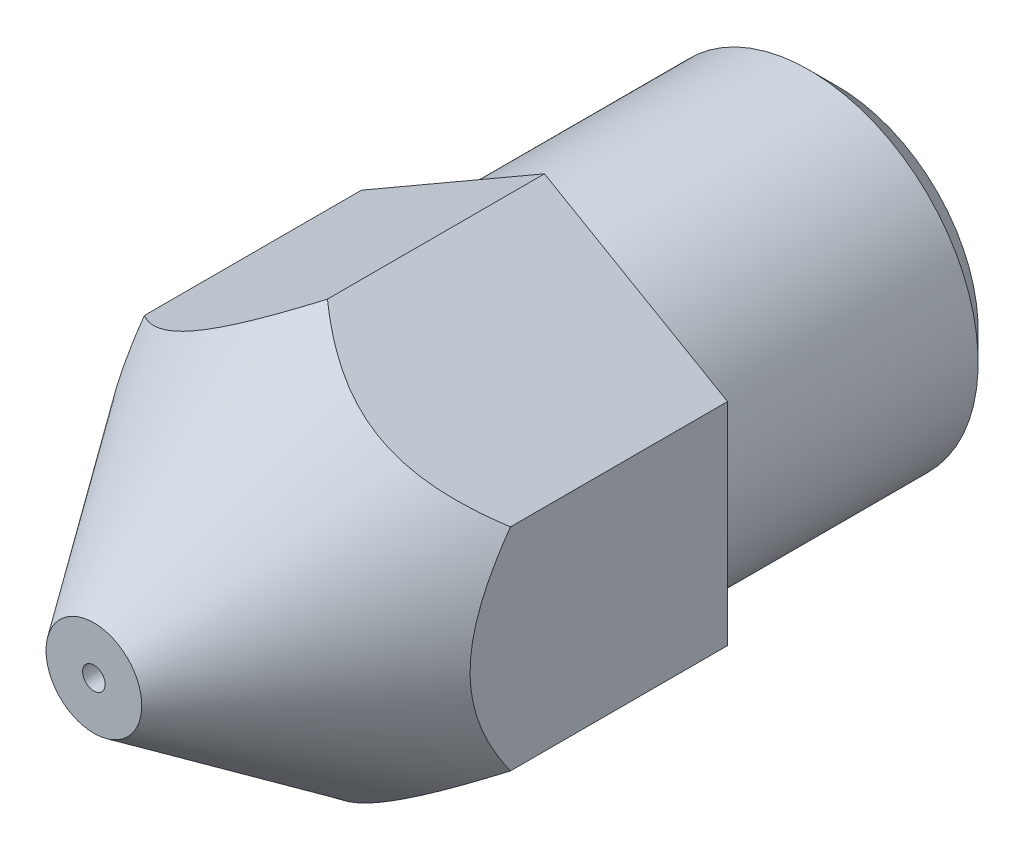
ISO-10303-21;
HEADER;
FILE_DESCRIPTION(('STEP AP214'),'2;1');
FILE_NAME('part.step','',(''),(''),'','','');
FILE_SCHEMA(('AUTOMOTIVE_DESIGN { 1 0 10303 214 1 1 1 1 }'));
ENDSEC;
DATA;
#1=APPLICATION_CONTEXT('core data for automotive mechanical design processes');
#2=APPLICATION_PROTOCOL_DEFINITION('international standard','automotive_design',2000,#1);
#3=PRODUCT_CONTEXT('',#1,'mechanical');
#4=PRODUCT('Part','Part','',(#3));
#5=PRODUCT_RELATED_PRODUCT_CATEGORY('part','',(#4));
#6=PRODUCT_DEFINITION_FORMATION('','',#4);
#7=PRODUCT_DEFINITION_CONTEXT('part definition',#1,'design');
#8=PRODUCT_DEFINITION('design','',#6,#7);
#9=PRODUCT_DEFINITION_SHAPE('','',#8);
#10=(LENGTH_UNIT() NAMED_UNIT(*) SI_UNIT(.MILLI.,.METRE.));
#11=(NAMED_UNIT(*) PLANE_ANGLE_UNIT() SI_UNIT($,.RADIAN.));
#12=(NAMED_UNIT(*) SI_UNIT($,.STERADIAN.) SOLID_ANGLE_UNIT());
#13=UNCERTAINTY_MEASURE_WITH_UNIT(LENGTH_MEASURE(1.E-05),#10,'distance_accuracy_value','');
#14=(GEOMETRIC_REPRESENTATION_CONTEXT(3) GLOBAL_UNCERTAINTY_ASSIGNED_CONTEXT((#13)) GLOBAL_UNIT_ASSIGNED_CONTEXT((#10,
#11,#12)) REPRESENTATION_CONTEXT('',''));
#15=CARTESIAN_POINT('',(0.,0.,0.));
#16=DIRECTION('',(0.,0.,1.));
#17=DIRECTION('',(1.,0.,0.));
#18=AXIS2_PLACEMENT_3D('',#15,#16,#17);
#19=CARTESIAN_POINT('',(-8.86966445564552,0.,-3.5));
#20=DIRECTION('',(0.,0.,-1.));
#21=DIRECTION('',(-1.,0.,0.));
#22=AXIS2_PLACEMENT_3D('',#19,#20,#21);
#23=PLANE('',#22);
#24=CARTESIAN_POINT('',(0.,0.,-3.5));
#25=DIRECTION('',(0.,0.,-1.));
#26=DIRECTION('',(-1.,0.,0.));
#27=AXIS2_PLACEMENT_3D('',#24,#25,#26);
#28=CIRCLE('',#27,3.);
#29=CARTESIAN_POINT('',(-3.,0.,-3.5));
#30=VERTEX_POINT('',#29);
#31=EDGE_CURVE('E190',#30,#30,#28,.T.);
#32=ORIENTED_EDGE('',*,*,#31,.F.);
#33=EDGE_LOOP('',(#32));
#34=FACE_BOUND('',#33,.T.);
#35=DIRECTION('',(0.866025403784438,-0.500000000000001,0.));
#36=VECTOR('',#35,1.);
#37=CARTESIAN_POINT('',(3.25,1.87638837486627,-3.5));
#38=LINE('',#37,#36);
#39=CARTESIAN_POINT('',(0.,3.75277674973256,-3.5));
#40=VERTEX_POINT('',#39);
#41=CARTESIAN_POINT('',(3.25,1.87638837486627,-3.5));
#42=VERTEX_POINT('',#41);
#43=EDGE_CURVE('E132',#40,#42,#38,.T.);
#44=ORIENTED_EDGE('',*,*,#43,.T.);
#45=DIRECTION('',(0.,-1.,0.));
#46=VECTOR('',#45,1.);
#47=CARTESIAN_POINT('',(3.25,1.87638837486627,-3.5));
#48=LINE('',#47,#46);
#49=CARTESIAN_POINT('',(3.25,-1.87638837486629,-3.5));
#50=VERTEX_POINT('',#49);
#51=EDGE_CURVE('E127',#42,#50,#48,.T.);
#52=ORIENTED_EDGE('',*,*,#51,.T.);
#53=DIRECTION('',(-0.866025403784439,-0.499999999999998,0.));
#54=VECTOR('',#53,1.);
#55=CARTESIAN_POINT('',(3.25,-1.87638837486629,-3.5));
#56=LINE('',#55,#54);
#57=CARTESIAN_POINT('',(0.,-3.75277674973256,-3.5));
#58=VERTEX_POINT('',#57);
#59=EDGE_CURVE('E125',#50,#58,#56,.T.);
#60=ORIENTED_EDGE('',*,*,#59,.T.);
#61=DIRECTION('',(-0.866025403784439,0.499999999999998,0.));
#62=VECTOR('',#61,1.);
#63=CARTESIAN_POINT('',(-3.25,-1.87638837486629,-3.5));
#64=LINE('',#63,#62);
#65=CARTESIAN_POINT('',(-3.25,-1.87638837486629,-3.5));
#66=VERTEX_POINT('',#65);
#67=EDGE_CURVE('E74',#58,#66,#64,.T.);
#68=ORIENTED_EDGE('',*,*,#67,.T.);
#69=DIRECTION('',(0.,1.,0.));
#70=VECTOR('',#69,1.);
#71=CARTESIAN_POINT('',(-3.25,1.87638837486627,-3.5));
#72=LINE('',#71,#70);
#73=CARTESIAN_POINT('',(-3.25,1.87638837486627,-3.5));
#74=VERTEX_POINT('',#73);
#75=EDGE_CURVE('E114',#66,#74,#72,.T.);
#76=ORIENTED_EDGE('',*,*,#75,.T.);
#77=DIRECTION('',(0.866025403784438,0.500000000000001,0.));
#78=VECTOR('',#77,1.);
#79=CARTESIAN_POINT('',(-3.25,1.87638837486627,-3.5));
#80=LINE('',#79,#78);
#81=EDGE_CURVE('E120',#74,#40,#80,.T.);
#82=ORIENTED_EDGE('',*,*,#81,.T.);
#83=EDGE_LOOP('',(#44,#52,#60,#68,#76,#82));
#84=FACE_BOUND('',#83,.T.);
#85=ADVANCED_FACE('F51',(#34,#84),#23,.T.);
#86=CARTESIAN_POINT('',(0.,0.,0.));
#87=DIRECTION('',(0.,0.,-1.));
#88=DIRECTION('',(-1.,0.,0.));
#89=AXIS2_PLACEMENT_3D('',#86,#87,#88);
#90=CYLINDRICAL_SURFACE('',#89,3.);
#91=CARTESIAN_POINT('',(0.,0.,-8.19999999999999));
#92=DIRECTION('',(0.,0.,-1.));
#93=DIRECTION('',(-1.,0.,0.));
#94=AXIS2_PLACEMENT_3D('',#91,#92,#93);
#95=CIRCLE('',#94,3.);
#96=CARTESIAN_POINT('',(-3.,0.,-8.19999999999999));
#97=VERTEX_POINT('',#96);
#98=EDGE_CURVE('E14',#97,#97,#95,.F.);
#99=ORIENTED_EDGE('',*,*,#98,.T.);
#100=EDGE_LOOP('',(#99));
#101=FACE_BOUND('',#100,.T.);
#102=ORIENTED_EDGE('',*,*,#31,.T.);
#103=EDGE_LOOP('',(#102));
#104=FACE_BOUND('',#103,.T.);
#105=ADVANCED_FACE('F213',(#101,#104),#90,.T.);
#106=CARTESIAN_POINT('',(-8.86966445564552,0.,-8.7));
#107=DIRECTION('',(0.,0.,-1.));
#108=DIRECTION('',(-1.,0.,0.));
#109=AXIS2_PLACEMENT_3D('',#106,#107,#108);
#110=PLANE('',#109);
#111=CARTESIAN_POINT('',(0.,0.,-8.7));
#112=DIRECTION('',(0.,0.,-1.));
#113=DIRECTION('',(-1.,0.,0.));
#114=AXIS2_PLACEMENT_3D('',#111,#112,#113);
#115=CIRCLE('',#114,2.5);
#116=CARTESIAN_POINT('',(-2.5,0.,-8.7));
#117=VERTEX_POINT('',#116);
#118=EDGE_CURVE('E59',#117,#117,#115,.T.);
#119=ORIENTED_EDGE('',*,*,#118,.T.);
#120=EDGE_LOOP('',(#119));
#121=FACE_BOUND('',#120,.T.);
#122=CARTESIAN_POINT('',(0.,0.,-8.7));
#123=DIRECTION('',(0.,0.,-1.));
#124=DIRECTION('',(-1.,0.,0.));
#125=AXIS2_PLACEMENT_3D('',#122,#123,#124);
#126=CIRCLE('',#125,0.999999999999999);
#127=CARTESIAN_POINT('',(-0.999999999999999,0.,-8.7));
#128=VERTEX_POINT('',#127);
#129=EDGE_CURVE('E187',#128,#128,#126,.T.);
#130=ORIENTED_EDGE('',*,*,#129,.F.);
#131=EDGE_LOOP('',(#130));
#132=FACE_BOUND('',#131,.T.);
#133=ADVANCED_FACE('F198',(#121,#132),#110,.T.);
#134=CARTESIAN_POINT('',(0.,0.,0.));
#135=DIRECTION('',(0.,0.,-1.));
#136=DIRECTION('',(-1.,0.,0.));
#137=AXIS2_PLACEMENT_3D('',#134,#135,#136);
#138=CYLINDRICAL_SURFACE('',#137,0.999999999999999);
#139=CARTESIAN_POINT('',(0.,0.,1.94115427318799));
#140=DIRECTION('',(0.,0.,-1.));
#141=DIRECTION('',(-1.,0.,0.));
#142=AXIS2_PLACEMENT_3D('',#139,#140,#141);
#143=CIRCLE('',#142,1.);
#144=CARTESIAN_POINT('',(-1.,0.,1.94115427318799));
#145=VERTEX_POINT('',#144);
#146=EDGE_CURVE('E178',#145,#145,#143,.T.);
#147=ORIENTED_EDGE('',*,*,#146,.F.);
#148=EDGE_LOOP('',(#147));
#149=FACE_BOUND('',#148,.T.);
#150=ORIENTED_EDGE('',*,*,#129,.T.);
#151=EDGE_LOOP('',(#150));
#152=FACE_BOUND('',#151,.T.);
#153=ADVANCED_FACE('F223',(#149,#152),#138,.F.);
#154=CARTESIAN_POINT('',(0.,0.,3.67320508075689));
#155=DIRECTION('',(0.,0.,-1.));
#156=DIRECTION('',(-1.,0.,0.));
#157=AXIS2_PLACEMENT_3D('',#154,#155,#156);
#158=CONICAL_SURFACE('',#157,0.,0.523598775598292);
#159=CARTESIAN_POINT('',(0.,0.,3.32679491924311));
#160=DIRECTION('',(0.,0.,-1.));
#161=DIRECTION('',(-1.,0.,0.));
#162=AXIS2_PLACEMENT_3D('',#159,#160,#161);
#163=CIRCLE('',#162,0.2);
#164=CARTESIAN_POINT('',(-0.2,0.,3.32679491924311));
#165=VERTEX_POINT('',#164);
#166=EDGE_CURVE('E238',#165,#165,#163,.T.);
#167=CARTESIAN_POINT('',(-0.2,0.,3.32679491924311));
#168=CARTESIAN_POINT('',(-0.208333333333333,0.,3.31236116251337));
#169=CARTESIAN_POINT('',(-0.216666666666666,0.,3.29792740578363));
#170=CARTESIAN_POINT('',(-0.233333333333333,0.,3.26905989232415));
#171=CARTESIAN_POINT('',(-0.241666666666666,0.,3.25462613559441));
#172=CARTESIAN_POINT('',(-0.258333333333333,0.,3.22575862213493));
#173=CARTESIAN_POINT('',(-0.266666666666666,0.,3.21132486540519));
#174=CARTESIAN_POINT('',(-0.283333333333333,0.,3.1824573519457));
#175=CARTESIAN_POINT('',(-0.291666666666666,0.,3.16802359521596));
#176=CARTESIAN_POINT('',(-0.308333333333333,0.,3.13915608175648));
#177=CARTESIAN_POINT('',(-0.316666666666666,0.,3.12472232502674));
#178=CARTESIAN_POINT('',(-0.333333333333333,0.,3.09585481156726));
#179=CARTESIAN_POINT('',(-0.341666666666666,0.,3.08142105483752));
#180=CARTESIAN_POINT('',(-0.358333333333333,0.,3.05255354137804));
#181=CARTESIAN_POINT('',(-0.366666666666666,0.,3.0381197846483));
#182=CARTESIAN_POINT('',(-0.383333333333333,0.,3.00925227118881));
#183=CARTESIAN_POINT('',(-0.391666666666666,0.,2.99481851445907));
#184=CARTESIAN_POINT('',(-0.408333333333333,0.,2.96595100099959));
#185=CARTESIAN_POINT('',(-0.416666666666666,0.,2.95151724426985));
#186=CARTESIAN_POINT('',(-0.433333333333333,0.,2.92264973081037));
#187=CARTESIAN_POINT('',(-0.441666666666666,0.,2.90821597408063));
#188=CARTESIAN_POINT('',(-0.458333333333333,0.,2.87934846062115));
#189=CARTESIAN_POINT('',(-0.466666666666666,0.,2.8649147038914));
#190=CARTESIAN_POINT('',(-0.483333333333333,0.,2.83604719043192));
#191=CARTESIAN_POINT('',(-0.491666666666666,0.,2.82161343370218));
#192=CARTESIAN_POINT('',(-0.508333333333333,0.,2.7927459202427));
#193=CARTESIAN_POINT('',(-0.516666666666666,0.,2.77831216351296));
#194=CARTESIAN_POINT('',(-0.533333333333333,0.,2.74944465005348));
#195=CARTESIAN_POINT('',(-0.541666666666666,0.,2.73501089332374));
#196=CARTESIAN_POINT('',(-0.558333333333333,0.,2.70614337986426));
#197=CARTESIAN_POINT('',(-0.566666666666666,0.,2.69170962313452));
#198=CARTESIAN_POINT('',(-0.583333333333333,0.,2.66284210967503));
#199=CARTESIAN_POINT('',(-0.591666666666666,0.,2.64840835294529));
#200=CARTESIAN_POINT('',(-0.608333333333333,0.,2.61954083948581));
#201=CARTESIAN_POINT('',(-0.616666666666666,0.,2.60510708275607));
#202=CARTESIAN_POINT('',(-0.633333333333333,0.,2.57623956929659));
#203=CARTESIAN_POINT('',(-0.641666666666666,0.,2.56180581256685));
#204=CARTESIAN_POINT('',(-0.658333333333333,0.,2.53293829910737));
#205=CARTESIAN_POINT('',(-0.666666666666666,0.,2.51850454237762));
#206=CARTESIAN_POINT('',(-0.683333333333333,0.,2.48963702891814));
#207=CARTESIAN_POINT('',(-0.691666666666666,0.,2.4752032721884));
#208=CARTESIAN_POINT('',(-0.708333333333333,0.,2.44633575872892));
#209=CARTESIAN_POINT('',(-0.716666666666666,0.,2.43190200199918));
#210=CARTESIAN_POINT('',(-0.733333333333333,0.,2.4030344885397));
#211=CARTESIAN_POINT('',(-0.741666666666666,0.,2.38860073180996));
#212=CARTESIAN_POINT('',(-0.758333333333333,0.,2.35973321835047));
#213=CARTESIAN_POINT('',(-0.766666666666666,0.,2.34529946162073));
#214=CARTESIAN_POINT('',(-0.783333333333333,0.,2.31643194816125));
#215=CARTESIAN_POINT('',(-0.791666666666666,0.,2.30199819143151));
#216=CARTESIAN_POINT('',(-0.808333333333333,0.,2.27313067797203));
#217=CARTESIAN_POINT('',(-0.816666666666666,0.,2.25869692124229));
#218=CARTESIAN_POINT('',(-0.833333333333333,0.,2.22982940778281));
#219=CARTESIAN_POINT('',(-0.841666666666666,0.,2.21539565105307));
#220=CARTESIAN_POINT('',(-0.858333333333333,0.,2.18652813759358));
#221=CARTESIAN_POINT('',(-0.866666666666666,0.,2.17209438086384));
#222=CARTESIAN_POINT('',(-0.883333333333333,0.,2.14322686740436));
#223=CARTESIAN_POINT('',(-0.891666666666666,0.,2.12879311067462));
#224=CARTESIAN_POINT('',(-0.908333333333333,0.,2.09992559721514));
#225=CARTESIAN_POINT('',(-0.916666666666666,0.,2.0854918404854));
#226=CARTESIAN_POINT('',(-0.933333333333333,0.,2.05662432702592));
#227=CARTESIAN_POINT('',(-0.941666666666666,0.,2.04219057029618));
#228=CARTESIAN_POINT('',(-0.958333333333333,0.,2.01332305683669));
#229=CARTESIAN_POINT('',(-0.966666666666666,0.,1.99888930010695));
#230=CARTESIAN_POINT('',(-0.983333333333333,0.,1.97002178664747));
#231=CARTESIAN_POINT('',(-0.991666666666666,0.,1.95558802991773));
#232=CARTESIAN_POINT('',(-1.,0.,1.94115427318799));
#233=B_SPLINE_CURVE_WITH_KNOTS('',3,(#167,#168,#169,#170,#171,#172,#173,#174,#175,#176,#177,
#178,#179,#180,#181,#182,#183,#184,#185,#186,#187,#188,#189,#190,#191,#192,#193,#194,#195,#196,
#197,#198,#199,#200,#201,#202,#203,#204,#205,#206,#207,#208,#209,#210,#211,#212,#213,#214,#215,
#216,#217,#218,#219,#220,#221,#222,#223,#224,#225,#226,#227,#228,#229,#230,#231,#232),
.UNSPECIFIED.,.F.,.F.,(4,2,2,2,2,2,2,2,2,2,2,2,2,2,2,2,2,2,2,2,2,2,2,2,2,2,2,2,2,2,2,2,4),(0.,
0.0500000000000005,0.100000000000001,0.150000000000001,0.200000000000002,0.250000000000002,
0.300000000000003,0.350000000000004,0.400000000000004,0.450000000000005,0.500000000000006,
0.550000000000006,0.600000000000007,0.650000000000007,0.700000000000008,0.750000000000008,
0.800000000000009,0.850000000000009,0.90000000000001,0.95000000000001,1.00000000000001,
1.05000000000001,1.10000000000001,1.15000000000001,1.20000000000001,1.25000000000001,
1.30000000000001,1.35000000000002,1.40000000000002,1.45000000000002,1.50000000000002,
1.55000000000002,1.60000000000002),.UNSPECIFIED.);
#234=EDGE_CURVE('BSEAM168',#165,#145,#233,.T.);
#235=ORIENTED_EDGE('',*,*,#166,.F.);
#236=ORIENTED_EDGE('',*,*,#146,.T.);
#237=ORIENTED_EDGE('',*,*,#234,.T.);
#238=ORIENTED_EDGE('',*,*,#234,.F.);
#239=EDGE_LOOP('',(#235,#237,#236,#238));
#240=FACE_BOUND('',#239,.T.);
#241=ADVANCED_FACE('F168',(#240),#158,.F.);
#242=CARTESIAN_POINT('',(3.25,1.87638837486627,6.5));
#243=DIRECTION('',(1.,0.,0.));
#244=DIRECTION('',(0.,0.,-1.));
#245=AXIS2_PLACEMENT_3D('',#242,#243,#244);
#246=PLANE('',#245);
#247=CARTESIAN_POINT('',(3.25,-10.4210247445194,-9.88007856899837));
#248=CARTESIAN_POINT('',(3.25,-10.1550139917363,-9.51733888773863));
#249=CARTESIAN_POINT('',(3.25,-9.88845372005929,-9.15499987226475));
#250=CARTESIAN_POINT('',(3.25,-9.35381845633714,-8.43138045471312));
#251=CARTESIAN_POINT('',(3.25,-9.08574330243901,-8.07010017226317));
#252=CARTESIAN_POINT('',(3.25,-8.5465114504986,-7.34731421528532));
#253=CARTESIAN_POINT('',(3.25,-8.27534631806567,-6.98581482421531));
#254=CARTESIAN_POINT('',(3.25,-7.73055095092708,-6.26472775277727));
#255=CARTESIAN_POINT('',(3.25,-7.45692093696118,-5.90513990572012));
#256=CARTESIAN_POINT('',(3.25,-6.87641455651948,-5.14958529105867));
#257=CARTESIAN_POINT('',(3.25,-6.56915612701845,-4.75391082353563));
#258=CARTESIAN_POINT('',(3.25,-6.10374655484884,-4.16386703706671));
#259=CARTESIAN_POINT('',(3.25,-5.94783218566263,-3.96773403080044));
#260=CARTESIAN_POINT('',(3.25,-5.63415525030047,-3.57695354048658));
#261=CARTESIAN_POINT('',(3.25,-5.47639270966761,-3.38230603596951));
#262=CARTESIAN_POINT('',(3.25,-5.15893896824527,-2.99535166046861));
#263=CARTESIAN_POINT('',(3.25,-4.99925317084273,-2.80304036404791));
#264=CARTESIAN_POINT('',(3.25,-4.67697917481463,-2.42086687340567));
#265=CARTESIAN_POINT('',(3.25,-4.51439105903882,-2.23100460953956));
#266=CARTESIAN_POINT('',(3.25,-4.18553282288163,-1.85464887331367));
#267=CARTESIAN_POINT('',(3.25,-4.01926450825845,-1.6681538269014));
#268=CARTESIAN_POINT('',(3.25,-3.68177983490181,-1.29970882436993));
#269=CARTESIAN_POINT('',(3.25,-3.51056428599972,-1.11775813335771));
#270=CARTESIAN_POINT('',(3.25,-3.26393070137452,-0.865405696541011));
#271=CARTESIAN_POINT('',(3.25,-3.19131776621962,-0.792260683589269));
#272=CARTESIAN_POINT('',(3.25,-3.04475880052873,-0.64731008286495));
#273=CARTESIAN_POINT('',(3.25,-2.97081272298777,-0.575504542502859));
#274=CARTESIAN_POINT('',(3.25,-2.82132836383634,-0.43343299674938));
#275=CARTESIAN_POINT('',(3.25,-2.74578873286427,-0.363168408007905));
#276=CARTESIAN_POINT('',(3.25,-2.59294548593326,-0.224582655782795));
#277=CARTESIAN_POINT('',(3.25,-2.51564191392237,-0.156261443975591));
#278=CARTESIAN_POINT('',(3.25,-2.35962863128407,-0.0225418631250719));
#279=CARTESIAN_POINT('',(3.25,-2.28093549668625,0.0428757763280529));
#280=CARTESIAN_POINT('',(3.25,-2.12123029837016,0.170812712160736));
#281=CARTESIAN_POINT('',(3.25,-2.04021848242268,0.23333231636352));
#282=CARTESIAN_POINT('',(3.25,-1.87560781430329,0.354678882841891));
#283=CARTESIAN_POINT('',(3.25,-1.79201214397981,0.413510136233417));
#284=CARTESIAN_POINT('',(3.25,-1.62178865576906,0.526580156933863));
#285=CARTESIAN_POINT('',(3.25,-1.53516194986874,0.580820584007462));
#286=CARTESIAN_POINT('',(3.25,-1.36359261683321,0.68050089431611));
#287=CARTESIAN_POINT('',(3.25,-1.27884180990056,0.726268165597501));
#288=CARTESIAN_POINT('',(3.25,-1.10607956257896,0.811279714200299));
#289=CARTESIAN_POINT('',(3.25,-1.01806782954458,0.850523404333305));
#290=CARTESIAN_POINT('',(3.25,-0.839332144532956,0.920658513948043));
#291=CARTESIAN_POINT('',(3.25,-0.748627228266093,0.951597782491712));
#292=CARTESIAN_POINT('',(3.25,-0.564445767595396,1.00368567339654));
#293=CARTESIAN_POINT('',(3.25,-0.470971158677319,1.02484096884422));
#294=CARTESIAN_POINT('',(3.25,-0.310212694805581,1.05127993409117));
#295=CARTESIAN_POINT('',(3.25,-0.243391087655945,1.05941089272303));
#296=CARTESIAN_POINT('',(3.25,-0.10929692359172,1.06978719391885));
#297=CARTESIAN_POINT('',(3.25,-0.0420244717026202,1.07203386252287));
#298=CARTESIAN_POINT('',(3.25,0.0924859824112473,1.07054346454063));
#299=CARTESIAN_POINT('',(3.25,0.159723951184364,1.06680344045538));
#300=CARTESIAN_POINT('',(3.25,0.293622107986032,1.05349619513517));
#301=CARTESIAN_POINT('',(3.25,0.360282201737023,1.04392804056198));
#302=CARTESIAN_POINT('',(3.25,0.508077283596722,1.01645864781881));
#303=CARTESIAN_POINT('',(3.25,0.588947438494195,0.997130940009137));
#304=CARTESIAN_POINT('',(3.25,0.748591314579005,0.951169900880215));
#305=CARTESIAN_POINT('',(3.25,0.827363941289587,0.92453283447244));
#306=CARTESIAN_POINT('',(3.25,0.982756746605187,0.864987828675293));
#307=CARTESIAN_POINT('',(3.25,1.05936949097002,0.832060694820529));
#308=CARTESIAN_POINT('',(3.25,1.21013939239264,0.761061461579141));
#309=CARTESIAN_POINT('',(3.25,1.28429673132707,0.722989744328014));
#310=CARTESIAN_POINT('',(3.25,1.45103081353316,0.631200477331064));
#311=CARTESIAN_POINT('',(3.25,1.54284959389495,0.576112203216528));
#312=CARTESIAN_POINT('',(3.25,1.7230453399982,0.460540297034059));
#313=CARTESIAN_POINT('',(3.25,1.81142065906605,0.400054128083829));
#314=CARTESIAN_POINT('',(3.25,1.98528352415769,0.274783953130048));
#315=CARTESIAN_POINT('',(3.25,2.07076582073379,0.209992706851875));
#316=CARTESIAN_POINT('',(3.25,2.23911308770665,0.0770901423910777));
#317=CARTESIAN_POINT('',(3.25,2.32197769933942,0.00897837234307764));
#318=CARTESIAN_POINT('',(3.25,2.48653368269927,-0.130809444597794));
#319=CARTESIAN_POINT('',(3.25,2.56819498510861,-0.202520747732823));
#320=CARTESIAN_POINT('',(3.25,2.72953550153858,-0.348137152915522));
#321=CARTESIAN_POINT('',(3.25,2.80921465145204,-0.422042325748641));
#322=CARTESIAN_POINT('',(3.25,2.96677477901546,-0.571556510047047));
#323=CARTESIAN_POINT('',(3.25,3.04465777148271,-0.647163403504266));
#324=CARTESIAN_POINT('',(3.25,3.19894935244089,-0.799857479381092));
#325=CARTESIAN_POINT('',(3.25,3.27535799486934,-0.876944607441241));
#326=CARTESIAN_POINT('',(3.25,3.52045427106936,-1.12827865568185));
#327=CARTESIAN_POINT('',(3.25,3.68661538469057,-1.30499036249059));
#328=CARTESIAN_POINT('',(3.25,4.01427116135899,-1.66270002440727));
#329=CARTESIAN_POINT('',(3.25,4.17576512723188,-1.84369861261292));
#330=CARTESIAN_POINT('',(3.25,4.49525237699607,-2.2088932701784));
#331=CARTESIAN_POINT('',(3.25,4.65324408250668,-2.39309071707174));
#332=CARTESIAN_POINT('',(3.25,4.96645230193129,-2.76383425544362));
#333=CARTESIAN_POINT('',(3.25,5.12166871810462,-2.95038042924733));
#334=CARTESIAN_POINT('',(3.25,5.43025696832106,-3.32571924627369));
#335=CARTESIAN_POINT('',(3.25,5.58362365431564,-3.51451611505903));
#336=CARTESIAN_POINT('',(3.25,5.88857051821366,-3.89354844509704));
#337=CARTESIAN_POINT('',(3.25,6.04015067551032,-4.08378392290192));
#338=CARTESIAN_POINT('',(3.25,6.49263276349124,-4.65609992811038));
#339=CARTESIAN_POINT('',(3.25,6.79136329703029,-5.03989668290531));
#340=CARTESIAN_POINT('',(3.25,7.35168819682291,-5.76754267052627));
#341=CARTESIAN_POINT('',(3.25,7.61370505420361,-6.11106794146315));
#342=CARTESIAN_POINT('',(3.25,8.13537826760182,-6.79994900303737));
#343=CARTESIAN_POINT('',(3.25,8.39503443121531,-7.14530493931204));
#344=CARTESIAN_POINT('',(3.25,8.91140905048834,-7.8358847368182));
#345=CARTESIAN_POINT('',(3.25,9.16813534621361,-8.18110274401208));
#346=CARTESIAN_POINT('',(3.25,9.68012114769552,-8.87257138198324));
#347=CARTESIAN_POINT('',(3.25,9.93538079836424,-9.21882190542288));
#348=CARTESIAN_POINT('',(3.25,10.190102552324,-9.5654654608227));
#349=B_SPLINE_CURVE_WITH_KNOTS('',3,(#247,#248,#249,#250,#251,#252,#253,#254,#255,#256,#257,
#258,#259,#260,#261,#262,#263,#264,#265,#266,#267,#268,#269,#270,#271,#272,#273,#274,#275,#276,
#277,#278,#279,#280,#281,#282,#283,#284,#285,#286,#287,#288,#289,#290,#291,#292,#293,#294,#295,
#296,#297,#298,#299,#300,#301,#302,#303,#304,#305,#306,#307,#308,#309,#310,#311,#312,#313,#314,
#315,#316,#317,#318,#319,#320,#321,#322,#323,#324,#325,#326,#327,#328,#329,#330,#331,#332,#333,
#334,#335,#336,#337,#338,#339,#340,#341,#342,#343,#344,#345,#346,#347,#348),.UNSPECIFIED.,.F.,
.F.,(4,2,2,2,2,2,2,2,2,2,2,2,2,2,2,2,2,2,2,2,2,2,2,2,2,2,2,2,2,2,2,2,2,2,2,2,2,2,2,2,2,2,2,2,2,
2,2,2,2,2,4),(0.,1.34947476346115,2.6990965413674,4.05478349288121,5.41035022098571,
6.91319924459298,7.66485369747401,8.41649777416655,9.16637554585057,9.91623194560433,
10.6657282314787,11.4151025168822,11.7242903697911,12.0334891456848,12.3429611768772,
12.6524255060691,12.9593698715412,13.2662815589661,13.572829285287,13.8792657048433,
14.1679991521169,14.4567585742705,14.7438166312515,15.0306786126203,15.2323856361125,
15.4340472004895,15.6358084188816,15.8376019565551,16.0866383217799,16.3358021825467,
16.5857388896212,16.8356570417937,17.1566345241216,17.4777636607688,17.7994472548494,
18.1211747473211,18.4471628340489,18.7731614502756,19.0987745945141,19.424375803867,
20.1519280197861,20.8795883608536,21.6075702337514,22.3355776945511,23.0652835436712,
23.7949978013873,25.2540134756318,26.5501364635593,27.8463641592974,29.1370015087049,
30.4275090645206),.UNSPECIFIED.);
#350=CARTESIAN_POINT('',(3.25,1.87638837486627,0.353176071810625));
#351=VERTEX_POINT('',#350);
#352=CARTESIAN_POINT('',(3.25,-1.87638837486629,0.353176071810616));
#353=VERTEX_POINT('',#352);
#354=EDGE_CURVE('E172',#351,#353,#349,.F.);
#355=ORIENTED_EDGE('',*,*,#354,.T.);
#356=DIRECTION('',(0.,0.,-1.));
#357=VECTOR('',#356,1.);
#358=CARTESIAN_POINT('',(3.25,-1.87638837486629,6.5));
#359=LINE('',#358,#357);
#360=EDGE_CURVE('E66',#353,#50,#359,.T.);
#361=ORIENTED_EDGE('',*,*,#360,.T.);
#362=ORIENTED_EDGE('',*,*,#51,.F.);
#363=DIRECTION('',(0.,0.,-1.));
#364=VECTOR('',#363,1.);
#365=CARTESIAN_POINT('',(3.25,1.87638837486627,6.5));
#366=LINE('',#365,#364);
#367=EDGE_CURVE('E134',#351,#42,#366,.T.);
#368=ORIENTED_EDGE('',*,*,#367,.F.);
#369=EDGE_LOOP('',(#355,#361,#362,#368));
#370=FACE_BOUND('',#369,.T.);
#371=ADVANCED_FACE('F163',(#370),#246,.T.);
#372=CARTESIAN_POINT('',(3.25,1.87638837486627,6.5));
#373=DIRECTION('',(0.500000000000001,0.866025403784438,0.));
#374=DIRECTION('',(-0.866025403784438,0.500000000000001,0.));
#375=AXIS2_PLACEMENT_3D('',#372,#373,#374);
#376=PLANE('',#375);
#377=CARTESIAN_POINT('',(-0.00019999999999998,3.7528922197864,0.353011106977679));
#378=CARTESIAN_POINT('',(0.0696924760585745,3.71253977991966,0.410613756754918));
#379=CARTESIAN_POINT('',(0.140732963459875,3.67152453539515,0.466468702287999));
#380=CARTESIAN_POINT('',(0.285650233103082,3.58785651075642,0.573685388217754));
#381=CARTESIAN_POINT('',(0.359536007165288,3.54519853921232,0.625030853673705));
#382=CARTESIAN_POINT('',(0.511798860795695,3.45728953968123,0.722839472228578));
#383=CARTESIAN_POINT('',(0.590237930434609,3.41200272171021,0.769176139046383));
#384=CARTESIAN_POINT('',(0.750144408050631,3.31968067381344,0.853921370951948));
#385=CARTESIAN_POINT('',(0.831607549638906,3.27264790708842,0.892340639215074));
#386=CARTESIAN_POINT('',(1.0278790506324,3.15933050315557,0.971525661471435));
#387=CARTESIAN_POINT('',(1.14404608904675,3.09226143225608,1.00806952115924));
#388=CARTESIAN_POINT('',(1.32043627578567,2.99042251045996,1.04531237413983));
#389=CARTESIAN_POINT('',(1.37932054816664,2.95642565994977,1.05479402211398));
#390=CARTESIAN_POINT('',(1.49759750266951,2.88813842842861,1.06769130783919));
#391=CARTESIAN_POINT('',(1.55699015004808,2.85384806747671,1.07110735685107));
#392=CARTESIAN_POINT('',(1.67596229605911,2.78515946695117,1.07170720821419));
#393=CARTESIAN_POINT('',(1.73554186081175,2.75076118920304,1.06887391054682));
#394=CARTESIAN_POINT('',(1.85423259473233,2.68223506202367,1.05708334674088));
#395=CARTESIAN_POINT('',(1.91334373096993,2.64810723160479,1.04812565385586));
#396=CARTESIAN_POINT('',(2.09046648052649,2.5458453644687,1.01234646240549));
#397=CARTESIAN_POINT('',(2.20718329898305,2.47845887791385,0.976622664700298));
#398=CARTESIAN_POINT('',(2.40539160789344,2.36402325740882,0.898184572275521));
#399=CARTESIAN_POINT('',(2.48820343613702,2.3162118260803,0.859650380228277));
#400=CARTESIAN_POINT('',(2.65072151526336,2.22238196934853,0.774359526769055));
#401=CARTESIAN_POINT('',(2.73042307679968,2.1763662513407,0.727590994350098));
#402=CARTESIAN_POINT('',(2.8850880350143,2.08707039608128,0.628705360068667));
#403=CARTESIAN_POINT('',(2.96011544004436,2.04375330359058,0.576719418243307));
#404=CARTESIAN_POINT('',(3.10721601496487,1.95882474706228,0.468079209892132));
#405=CARTESIAN_POINT('',(3.17929900168905,1.91720761527308,0.411442745491608));
#406=CARTESIAN_POINT('',(3.2502,1.87627290481244,0.353011106977682));
#407=B_SPLINE_CURVE_WITH_KNOTS('',3,(#377,#378,#379,#380,#381,#382,#383,#384,#385,#386,#387,
#388,#389,#390,#391,#392,#393,#394,#395,#396,#397,#398,#399,#400,#401,#402,#403,#404,#405,#406),
.UNSPECIFIED.,.F.,.F.,(4,2,2,2,2,2,2,2,2,2,2,2,2,2,4),(0.,0.297528461773674,0.596090016316984,
0.900977038685541,1.20544915439333,1.62057804961722,1.82630352318148,2.03201504757745,
2.23829015627292,2.4445796396355,2.86086238799738,3.1697665296011,3.4791197036515,
3.78205208298373,4.08387454941209),.UNSPECIFIED.);
#408=CARTESIAN_POINT('',(0.,3.75277674973256,0.353176071810624));
#409=VERTEX_POINT('',#408);
#410=EDGE_CURVE('E179',#409,#351,#407,.T.);
#411=ORIENTED_EDGE('',*,*,#410,.T.);
#412=ORIENTED_EDGE('',*,*,#367,.T.);
#413=ORIENTED_EDGE('',*,*,#43,.F.);
#414=DIRECTION('',(0.,0.,-1.));
#415=VECTOR('',#414,1.);
#416=CARTESIAN_POINT('',(0.,3.75277674973256,6.5));
#417=LINE('',#416,#415);
#418=EDGE_CURVE('E137',#409,#40,#417,.T.);
#419=ORIENTED_EDGE('',*,*,#418,.F.);
#420=EDGE_LOOP('',(#411,#412,#413,#419));
#421=FACE_BOUND('',#420,.T.);
#422=ADVANCED_FACE('F167',(#421),#376,.T.);
#423=CARTESIAN_POINT('',(-3.25,1.87638837486627,6.5));
#424=DIRECTION('',(-0.500000000000001,0.866025403784438,0.));
#425=DIRECTION('',(-0.866025403784438,-0.500000000000001,0.));
#426=AXIS2_PLACEMENT_3D('',#423,#424,#425);
#427=PLANE('',#426);
#428=CARTESIAN_POINT('',(-3.2502,1.87627290481244,0.353011106977683));
#429=CARTESIAN_POINT('',(-3.18030752394143,1.91662534467918,0.410613756754921));
#430=CARTESIAN_POINT('',(-3.10926703654012,1.95764058920369,0.466468702288002));
#431=CARTESIAN_POINT('',(-2.96434976689692,2.04130861384242,0.573685388217757));
#432=CARTESIAN_POINT('',(-2.89046399283471,2.08396658538652,0.625030853673708));
#433=CARTESIAN_POINT('',(-2.7382011392043,2.17187558491761,0.72283947222858));
#434=CARTESIAN_POINT('',(-2.65976206956539,2.21716240288863,0.769176139046386));
#435=CARTESIAN_POINT('',(-2.49985559194937,2.3094844507854,0.85392137095195));
#436=CARTESIAN_POINT('',(-2.41839245036109,2.35651721751042,0.892340639215076));
#437=CARTESIAN_POINT('',(-2.2221209493676,2.46983462144327,0.971525661471436));
#438=CARTESIAN_POINT('',(-2.10595391095325,2.53690369234276,1.00806952115924));
#439=CARTESIAN_POINT('',(-1.92956372421433,2.63874261413888,1.04531237413983));
#440=CARTESIAN_POINT('',(-1.87067945183336,2.67273946464907,1.05479402211398));
#441=CARTESIAN_POINT('',(-1.75240249733049,2.74102669617023,1.06769130783919));
#442=CARTESIAN_POINT('',(-1.69300984995192,2.77531705712213,1.07110735685107));
#443=CARTESIAN_POINT('',(-1.57403770394089,2.84400565764767,1.07170720821419));
#444=CARTESIAN_POINT('',(-1.51445813918825,2.8784039353958,1.06887391054682));
#445=CARTESIAN_POINT('',(-1.39576740526766,2.94693006257517,1.05708334674088));
#446=CARTESIAN_POINT('',(-1.33665626903007,2.98105789299405,1.04812565385586));
#447=CARTESIAN_POINT('',(-1.15953351947351,3.08331976013014,1.01234646240549));
#448=CARTESIAN_POINT('',(-1.04281670101695,3.15070624668499,0.976622664700296));
#449=CARTESIAN_POINT('',(-0.84460839210656,3.26514186719002,0.898184572275519));
#450=CARTESIAN_POINT('',(-0.761796563862977,3.31295329851854,0.859650380228275));
#451=CARTESIAN_POINT('',(-0.599278484736643,3.40678315525031,0.774359526769053));
#452=CARTESIAN_POINT('',(-0.519576923200323,3.45279887325814,0.727590994350095));
#453=CARTESIAN_POINT('',(-0.364911964985697,3.54209472851756,0.628705360068664));
#454=CARTESIAN_POINT('',(-0.289884559955637,3.58541182100826,0.576719418243304));
#455=CARTESIAN_POINT('',(-0.142783985035131,3.67034037753656,0.46807920989213));
#456=CARTESIAN_POINT('',(-0.0707009983109478,3.71195750932576,0.411442745491606));
#457=CARTESIAN_POINT('',(0.000200000000000344,3.7528922197864,0.35301110697768));
#458=B_SPLINE_CURVE_WITH_KNOTS('',3,(#428,#429,#430,#431,#432,#433,#434,#435,#436,#437,#438,
#439,#440,#441,#442,#443,#444,#445,#446,#447,#448,#449,#450,#451,#452,#453,#454,#455,#456,#457),
.UNSPECIFIED.,.F.,.F.,(4,2,2,2,2,2,2,2,2,2,2,2,2,2,4),(0.,0.297528461773674,0.596090016316985,
0.900977038685541,1.20544915439333,1.62057804961722,1.82630352318148,2.03201504757745,
2.23829015627292,2.4445796396355,2.86086238799738,3.1697665296011,3.4791197036515,
3.78205208298373,4.08387454941209),.UNSPECIFIED.);
#459=CARTESIAN_POINT('',(-3.25,1.87638837486627,0.353176071810625));
#460=VERTEX_POINT('',#459);
#461=EDGE_CURVE('E259',#460,#409,#458,.T.);
#462=ORIENTED_EDGE('',*,*,#461,.T.);
#463=ORIENTED_EDGE('',*,*,#418,.T.);
#464=ORIENTED_EDGE('',*,*,#81,.F.);
#465=DIRECTION('',(0.,0.,-1.));
#466=VECTOR('',#465,1.);
#467=CARTESIAN_POINT('',(-3.25,1.87638837486627,6.5));
#468=LINE('',#467,#466);
#469=EDGE_CURVE('E110',#460,#74,#468,.T.);
#470=ORIENTED_EDGE('',*,*,#469,.F.);
#471=EDGE_LOOP('',(#462,#463,#464,#470));
#472=FACE_BOUND('',#471,.T.);
#473=ADVANCED_FACE('F269',(#472),#427,.T.);
#474=CARTESIAN_POINT('',(-3.25,1.87638837486627,6.5));
#475=DIRECTION('',(-1.,0.,0.));
#476=DIRECTION('',(0.,0.,1.));
#477=AXIS2_PLACEMENT_3D('',#474,#475,#476);
#478=PLANE('',#477);
#479=CARTESIAN_POINT('',(-3.25,-10.4210247445194,-9.88007856899837));
#480=CARTESIAN_POINT('',(-3.25,-10.1550139917363,-9.51733888773863));
#481=CARTESIAN_POINT('',(-3.25,-9.88845372005929,-9.15499987226475));
#482=CARTESIAN_POINT('',(-3.25,-9.35381845633714,-8.43138045471312));
#483=CARTESIAN_POINT('',(-3.25,-9.08574330243901,-8.07010017226317));
#484=CARTESIAN_POINT('',(-3.25,-8.5465114504986,-7.34731421528532));
#485=CARTESIAN_POINT('',(-3.25,-8.27534631806567,-6.98581482421531));
#486=CARTESIAN_POINT('',(-3.25,-7.73055095092708,-6.26472775277727));
#487=CARTESIAN_POINT('',(-3.25,-7.45692093696118,-5.90513990572012));
#488=CARTESIAN_POINT('',(-3.25,-6.87641455651948,-5.14958529105867));
#489=CARTESIAN_POINT('',(-3.25,-6.56915612701845,-4.75391082353563));
#490=CARTESIAN_POINT('',(-3.25,-6.10374655484884,-4.16386703706671));
#491=CARTESIAN_POINT('',(-3.25,-5.94783218566263,-3.96773403080044));
#492=CARTESIAN_POINT('',(-3.25,-5.63415525030047,-3.57695354048658));
#493=CARTESIAN_POINT('',(-3.25,-5.47639270966761,-3.38230603596951));
#494=CARTESIAN_POINT('',(-3.25,-5.15893896824527,-2.99535166046861));
#495=CARTESIAN_POINT('',(-3.25,-4.99925317084273,-2.80304036404791));
#496=CARTESIAN_POINT('',(-3.25,-4.67697917481463,-2.42086687340567));
#497=CARTESIAN_POINT('',(-3.25,-4.51439105903882,-2.23100460953956));
#498=CARTESIAN_POINT('',(-3.25,-4.18553282288163,-1.85464887331367));
#499=CARTESIAN_POINT('',(-3.25,-4.01926450825845,-1.6681538269014));
#500=CARTESIAN_POINT('',(-3.25,-3.68177983490181,-1.29970882436993));
#501=CARTESIAN_POINT('',(-3.25,-3.51056428599972,-1.11775813335771));
#502=CARTESIAN_POINT('',(-3.25,-3.26393070137452,-0.865405696541011));
#503=CARTESIAN_POINT('',(-3.25,-3.19131776621962,-0.792260683589269));
#504=CARTESIAN_POINT('',(-3.25,-3.04475880052873,-0.64731008286495));
#505=CARTESIAN_POINT('',(-3.25,-2.97081272298777,-0.575504542502859));
#506=CARTESIAN_POINT('',(-3.25,-2.82132836383634,-0.43343299674938));
#507=CARTESIAN_POINT('',(-3.25,-2.74578873286427,-0.363168408007905));
#508=CARTESIAN_POINT('',(-3.25,-2.59294548593326,-0.224582655782795));
#509=CARTESIAN_POINT('',(-3.25,-2.51564191392237,-0.156261443975591));
#510=CARTESIAN_POINT('',(-3.25,-2.35962863128407,-0.0225418631250719));
#511=CARTESIAN_POINT('',(-3.25,-2.28093549668625,0.0428757763280529));
#512=CARTESIAN_POINT('',(-3.25,-2.12123029837016,0.170812712160736));
#513=CARTESIAN_POINT('',(-3.25,-2.04021848242268,0.23333231636352));
#514=CARTESIAN_POINT('',(-3.25,-1.87560781430329,0.354678882841891));
#515=CARTESIAN_POINT('',(-3.25,-1.79201214397981,0.413510136233417));
#516=CARTESIAN_POINT('',(-3.25,-1.62178865576906,0.526580156933863));
#517=CARTESIAN_POINT('',(-3.25,-1.53516194986874,0.580820584007462));
#518=CARTESIAN_POINT('',(-3.25,-1.36359261683321,0.68050089431611));
#519=CARTESIAN_POINT('',(-3.25,-1.27884180990056,0.726268165597501));
#520=CARTESIAN_POINT('',(-3.25,-1.10607956257896,0.811279714200299));
#521=CARTESIAN_POINT('',(-3.25,-1.01806782954458,0.850523404333305));
#522=CARTESIAN_POINT('',(-3.25,-0.839332144532956,0.920658513948043));
#523=CARTESIAN_POINT('',(-3.25,-0.748627228266093,0.951597782491712));
#524=CARTESIAN_POINT('',(-3.25,-0.564445767595396,1.00368567339654));
#525=CARTESIAN_POINT('',(-3.25,-0.470971158677319,1.02484096884422));
#526=CARTESIAN_POINT('',(-3.25,-0.310212694805581,1.05127993409117));
#527=CARTESIAN_POINT('',(-3.25,-0.243391087655945,1.05941089272303));
#528=CARTESIAN_POINT('',(-3.25,-0.10929692359172,1.06978719391885));
#529=CARTESIAN_POINT('',(-3.25,-0.0420244717026202,1.07203386252287));
#530=CARTESIAN_POINT('',(-3.25,0.0924859824112473,1.07054346454063));
#531=CARTESIAN_POINT('',(-3.25,0.159723951184364,1.06680344045538));
#532=CARTESIAN_POINT('',(-3.25,0.293622107986032,1.05349619513517));
#533=CARTESIAN_POINT('',(-3.25,0.360282201737023,1.04392804056198));
#534=CARTESIAN_POINT('',(-3.25,0.508077283596722,1.01645864781881));
#535=CARTESIAN_POINT('',(-3.25,0.588947438494195,0.997130940009137));
#536=CARTESIAN_POINT('',(-3.25,0.748591314579005,0.951169900880215));
#537=CARTESIAN_POINT('',(-3.25,0.827363941289587,0.92453283447244));
#538=CARTESIAN_POINT('',(-3.25,0.982756746605187,0.864987828675293));
#539=CARTESIAN_POINT('',(-3.25,1.05936949097002,0.832060694820529));
#540=CARTESIAN_POINT('',(-3.25,1.21013939239264,0.761061461579141));
#541=CARTESIAN_POINT('',(-3.25,1.28429673132707,0.722989744328014));
#542=CARTESIAN_POINT('',(-3.25,1.45103081353316,0.631200477331064));
#543=CARTESIAN_POINT('',(-3.25,1.54284959389495,0.576112203216528));
#544=CARTESIAN_POINT('',(-3.25,1.7230453399982,0.460540297034059));
#545=CARTESIAN_POINT('',(-3.25,1.81142065906605,0.400054128083829));
#546=CARTESIAN_POINT('',(-3.25,1.98528352415769,0.274783953130048));
#547=CARTESIAN_POINT('',(-3.25,2.07076582073379,0.209992706851875));
#548=CARTESIAN_POINT('',(-3.25,2.23911308770665,0.0770901423910777));
#549=CARTESIAN_POINT('',(-3.25,2.32197769933942,0.00897837234307764));
#550=CARTESIAN_POINT('',(-3.25,2.48653368269927,-0.130809444597794));
#551=CARTESIAN_POINT('',(-3.25,2.56819498510861,-0.202520747732823));
#552=CARTESIAN_POINT('',(-3.25,2.72953550153858,-0.348137152915522));
#553=CARTESIAN_POINT('',(-3.25,2.80921465145204,-0.422042325748641));
#554=CARTESIAN_POINT('',(-3.25,2.96677477901546,-0.571556510047047));
#555=CARTESIAN_POINT('',(-3.25,3.04465777148271,-0.647163403504266));
#556=CARTESIAN_POINT('',(-3.25,3.19894935244089,-0.799857479381092));
#557=CARTESIAN_POINT('',(-3.25,3.27535799486934,-0.876944607441241));
#558=CARTESIAN_POINT('',(-3.25,3.52045427106936,-1.12827865568185));
#559=CARTESIAN_POINT('',(-3.25,3.68661538469057,-1.30499036249059));
#560=CARTESIAN_POINT('',(-3.25,4.01427116135899,-1.66270002440727));
#561=CARTESIAN_POINT('',(-3.25,4.17576512723188,-1.84369861261292));
#562=CARTESIAN_POINT('',(-3.25,4.49525237699607,-2.2088932701784));
#563=CARTESIAN_POINT('',(-3.25,4.65324408250668,-2.39309071707174));
#564=CARTESIAN_POINT('',(-3.25,4.96645230193129,-2.76383425544362));
#565=CARTESIAN_POINT('',(-3.25,5.12166871810462,-2.95038042924733));
#566=CARTESIAN_POINT('',(-3.25,5.43025696832106,-3.32571924627369));
#567=CARTESIAN_POINT('',(-3.25,5.58362365431564,-3.51451611505903));
#568=CARTESIAN_POINT('',(-3.25,5.88857051821366,-3.89354844509704));
#569=CARTESIAN_POINT('',(-3.25,6.04015067551032,-4.08378392290192));
#570=CARTESIAN_POINT('',(-3.25,6.49263276349124,-4.65609992811038));
#571=CARTESIAN_POINT('',(-3.25,6.79136329703029,-5.03989668290531));
#572=CARTESIAN_POINT('',(-3.25,7.35168819682291,-5.76754267052627));
#573=CARTESIAN_POINT('',(-3.25,7.61370505420361,-6.11106794146315));
#574=CARTESIAN_POINT('',(-3.25,8.13537826760182,-6.79994900303737));
#575=CARTESIAN_POINT('',(-3.25,8.39503443121531,-7.14530493931204));
#576=CARTESIAN_POINT('',(-3.25,8.91140905048834,-7.8358847368182));
#577=CARTESIAN_POINT('',(-3.25,9.16813534621361,-8.18110274401208));
#578=CARTESIAN_POINT('',(-3.25,9.68012114769552,-8.87257138198324));
#579=CARTESIAN_POINT('',(-3.25,9.93538079836424,-9.21882190542288));
#580=CARTESIAN_POINT('',(-3.25,10.190102552324,-9.5654654608227));
#581=B_SPLINE_CURVE_WITH_KNOTS('',3,(#479,#480,#481,#482,#483,#484,#485,#486,#487,#488,#489,
#490,#491,#492,#493,#494,#495,#496,#497,#498,#499,#500,#501,#502,#503,#504,#505,#506,#507,#508,
#509,#510,#511,#512,#513,#514,#515,#516,#517,#518,#519,#520,#521,#522,#523,#524,#525,#526,#527,
#528,#529,#530,#531,#532,#533,#534,#535,#536,#537,#538,#539,#540,#541,#542,#543,#544,#545,#546,
#547,#548,#549,#550,#551,#552,#553,#554,#555,#556,#557,#558,#559,#560,#561,#562,#563,#564,#565,
#566,#567,#568,#569,#570,#571,#572,#573,#574,#575,#576,#577,#578,#579,#580),.UNSPECIFIED.,.F.,
.F.,(4,2,2,2,2,2,2,2,2,2,2,2,2,2,2,2,2,2,2,2,2,2,2,2,2,2,2,2,2,2,2,2,2,2,2,2,2,2,2,2,2,2,2,2,2,
2,2,2,2,2,4),(0.,1.34947476346115,2.6990965413674,4.05478349288121,5.41035022098571,
6.91319924459298,7.66485369747401,8.41649777416655,9.16637554585057,9.91623194560433,
10.6657282314787,11.4151025168822,11.7242903697911,12.0334891456848,12.3429611768772,
12.6524255060691,12.9593698715412,13.2662815589661,13.572829285287,13.8792657048433,
14.1679991521169,14.4567585742705,14.7438166312515,15.0306786126203,15.2323856361125,
15.4340472004895,15.6358084188816,15.8376019565551,16.0866383217799,16.3358021825467,
16.5857388896212,16.8356570417937,17.1566345241216,17.4777636607688,17.7994472548494,
18.1211747473211,18.4471628340489,18.7731614502756,19.0987745945141,19.424375803867,
20.1519280197861,20.8795883608536,21.6075702337514,22.3355776945511,23.0652835436712,
23.7949978013873,25.2540134756318,26.5501364635593,27.8463641592974,29.1370015087049,
30.4275090645206),.UNSPECIFIED.);
#582=CARTESIAN_POINT('',(-3.25,-1.87638837486629,0.353176071810616));
#583=VERTEX_POINT('',#582);
#584=EDGE_CURVE('E260',#583,#460,#581,.T.);
#585=ORIENTED_EDGE('',*,*,#584,.T.);
#586=ORIENTED_EDGE('',*,*,#469,.T.);
#587=ORIENTED_EDGE('',*,*,#75,.F.);
#588=DIRECTION('',(0.,0.,-1.));
#589=VECTOR('',#588,1.);
#590=CARTESIAN_POINT('',(-3.25,-1.87638837486629,6.5));
#591=LINE('',#590,#589);
#592=EDGE_CURVE('E103',#583,#66,#591,.T.);
#593=ORIENTED_EDGE('',*,*,#592,.F.);
#594=EDGE_LOOP('',(#585,#586,#587,#593));
#595=FACE_BOUND('',#594,.T.);
#596=ADVANCED_FACE('F115',(#595),#478,.T.);
#597=CARTESIAN_POINT('',(-3.25,-1.87638837486629,6.5));
#598=DIRECTION('',(-0.499999999999998,-0.866025403784439,0.));
#599=DIRECTION('',(0.86602540378444,-0.499999999999998,0.));
#600=AXIS2_PLACEMENT_3D('',#597,#598,#599);
#601=PLANE('',#600);
#602=CARTESIAN_POINT('',(0.00019999999999996,-3.7528922197864,0.353011106977679));
#603=CARTESIAN_POINT('',(-0.0696924760585755,-3.71253977991966,0.410613756754918));
#604=CARTESIAN_POINT('',(-0.140732963459876,-3.67152453539515,0.466468702287999));
#605=CARTESIAN_POINT('',(-0.285650233103084,-3.58785651075642,0.573685388217754));
#606=CARTESIAN_POINT('',(-0.359536007165289,-3.54519853921232,0.625030853673704));
#607=CARTESIAN_POINT('',(-0.511798860795698,-3.45728953968123,0.722839472228577));
#608=CARTESIAN_POINT('',(-0.590237930434611,-3.41200272171022,0.769176139046382));
#609=CARTESIAN_POINT('',(-0.750144408050634,-3.31968067381344,0.853921370951945));
#610=CARTESIAN_POINT('',(-0.83160754963891,-3.27264790708842,0.89234063921507));
#611=CARTESIAN_POINT('',(-1.0278790506324,-3.15933050315557,0.97152566147143));
#612=CARTESIAN_POINT('',(-1.14404608904676,-3.09226143225608,1.00806952115924));
#613=CARTESIAN_POINT('',(-1.32043627578568,-2.99042251045996,1.04531237413982));
#614=CARTESIAN_POINT('',(-1.37932054816665,-2.95642565994977,1.05479402211397));
#615=CARTESIAN_POINT('',(-1.49759750266951,-2.88813842842861,1.06769130783918));
#616=CARTESIAN_POINT('',(-1.55699015004809,-2.85384806747671,1.07110735685107));
#617=CARTESIAN_POINT('',(-1.67596229605912,-2.78515946695117,1.07170720821418));
#618=CARTESIAN_POINT('',(-1.73554186081175,-2.75076118920304,1.06887391054681));
#619=CARTESIAN_POINT('',(-1.85423259473234,-2.68223506202367,1.05708334674087));
#620=CARTESIAN_POINT('',(-1.91334373096994,-2.64810723160479,1.04812565385585));
#621=CARTESIAN_POINT('',(-2.0904664805265,-2.54584536446871,1.01234646240548));
#622=CARTESIAN_POINT('',(-2.20718329898306,-2.47845887791385,0.976622664700286));
#623=CARTESIAN_POINT('',(-2.40539160789345,-2.36402325740882,0.898184572275507));
#624=CARTESIAN_POINT('',(-2.48820343613703,-2.31621182608031,0.859650380228262));
#625=CARTESIAN_POINT('',(-2.65072151526336,-2.22238196934854,0.774359526769041));
#626=CARTESIAN_POINT('',(-2.73042307679968,-2.17636625134071,0.727590994350085));
#627=CARTESIAN_POINT('',(-2.88508803501431,-2.08707039608129,0.628705360068655));
#628=CARTESIAN_POINT('',(-2.96011544004436,-2.04375330359059,0.576719418243294));
#629=CARTESIAN_POINT('',(-3.10721601496487,-1.95882474706229,0.46807920989212));
#630=CARTESIAN_POINT('',(-3.17929900168905,-1.91720761527309,0.411442745491596));
#631=CARTESIAN_POINT('',(-3.2502,-1.87627290481245,0.353011106977673));
#632=B_SPLINE_CURVE_WITH_KNOTS('',3,(#602,#603,#604,#605,#606,#607,#608,#609,#610,#611,#612,
#613,#614,#615,#616,#617,#618,#619,#620,#621,#622,#623,#624,#625,#626,#627,#628,#629,#630,#631),
.UNSPECIFIED.,.F.,.F.,(4,2,2,2,2,2,2,2,2,2,2,2,2,2,4),(0.,0.297528461773675,0.596090016316985,
0.900977038685541,1.20544915439333,1.62057804961722,1.82630352318148,2.03201504757745,
2.23829015627292,2.4445796396355,2.86086238799738,3.16976652960109,3.4791197036515,
3.78205208298372,4.08387454941208),.UNSPECIFIED.);
#633=CARTESIAN_POINT('',(0.,-3.75277674973256,0.353176071810624));
#634=VERTEX_POINT('',#633);
#635=EDGE_CURVE('E107',#634,#583,#632,.T.);
#636=ORIENTED_EDGE('',*,*,#635,.T.);
#637=ORIENTED_EDGE('',*,*,#592,.T.);
#638=ORIENTED_EDGE('',*,*,#67,.F.);
#639=DIRECTION('',(0.,0.,-1.));
#640=VECTOR('',#639,1.);
#641=CARTESIAN_POINT('',(0.,-3.75277674973256,6.5));
#642=LINE('',#641,#640);
#643=EDGE_CURVE('E111',#634,#58,#642,.T.);
#644=ORIENTED_EDGE('',*,*,#643,.F.);
#645=EDGE_LOOP('',(#636,#637,#638,#644));
#646=FACE_BOUND('',#645,.T.);
#647=ADVANCED_FACE('F105',(#646),#601,.T.);
#648=CARTESIAN_POINT('',(3.25,-1.87638837486629,6.5));
#649=DIRECTION('',(0.499999999999998,-0.866025403784439,0.));
#650=DIRECTION('',(0.86602540378444,0.499999999999998,0.));
#651=AXIS2_PLACEMENT_3D('',#648,#649,#650);
#652=PLANE('',#651);
#653=CARTESIAN_POINT('',(3.2502,-1.87627290481245,0.353011106977672));
#654=CARTESIAN_POINT('',(3.18030752394143,-1.9166253446792,0.410613756754911));
#655=CARTESIAN_POINT('',(3.10926703654012,-1.9576405892037,0.466468702287992));
#656=CARTESIAN_POINT('',(2.96434976689692,-2.04130861384243,0.573685388217747));
#657=CARTESIAN_POINT('',(2.89046399283471,-2.08396658538653,0.625030853673697));
#658=CARTESIAN_POINT('',(2.7382011392043,-2.17187558491763,0.72283947222857));
#659=CARTESIAN_POINT('',(2.65976206956539,-2.21716240288864,0.769176139046376));
#660=CARTESIAN_POINT('',(2.49985559194937,-2.30948445078541,0.85392137095194));
#661=CARTESIAN_POINT('',(2.41839245036109,-2.35651721751044,0.892340639215066));
#662=CARTESIAN_POINT('',(2.2221209493676,-2.46983462144328,0.971525661471426));
#663=CARTESIAN_POINT('',(2.10595391095324,-2.53690369234277,1.00806952115923));
#664=CARTESIAN_POINT('',(1.92956372421432,-2.63874261413889,1.04531237413982));
#665=CARTESIAN_POINT('',(1.87067945183335,-2.67273946464908,1.05479402211397));
#666=CARTESIAN_POINT('',(1.75240249733049,-2.74102669617024,1.06769130783918));
#667=CARTESIAN_POINT('',(1.69300984995191,-2.77531705712214,1.07110735685106));
#668=CARTESIAN_POINT('',(1.57403770394088,-2.84400565764768,1.07170720821418));
#669=CARTESIAN_POINT('',(1.51445813918825,-2.87840393539581,1.06887391054681));
#670=CARTESIAN_POINT('',(1.39576740526766,-2.94693006257518,1.05708334674087));
#671=CARTESIAN_POINT('',(1.33665626903006,-2.98105789299406,1.04812565385585));
#672=CARTESIAN_POINT('',(1.1595335194735,-3.08331976013015,1.01234646240548));
#673=CARTESIAN_POINT('',(1.04281670101694,-3.150706246685,0.976622664700288));
#674=CARTESIAN_POINT('',(0.844608392106551,-3.26514186719003,0.89818457227551));
#675=CARTESIAN_POINT('',(0.76179656386297,-3.31295329851855,0.859650380228267));
#676=CARTESIAN_POINT('',(0.599278484736637,-3.40678315525032,0.774359526769047));
#677=CARTESIAN_POINT('',(0.519576923200317,-3.45279887325814,0.727590994350091));
#678=CARTESIAN_POINT('',(0.364911964985693,-3.54209472851756,0.628705360068662));
#679=CARTESIAN_POINT('',(0.289884559955634,-3.58541182100826,0.576719418243301));
#680=CARTESIAN_POINT('',(0.14278398503513,-3.67034037753656,0.468079209892127));
#681=CARTESIAN_POINT('',(0.070700998310948,-3.71195750932576,0.411442745491604));
#682=CARTESIAN_POINT('',(-0.000199999999999526,-3.7528922197864,0.353011106977679));
#683=B_SPLINE_CURVE_WITH_KNOTS('',3,(#653,#654,#655,#656,#657,#658,#659,#660,#661,#662,#663,
#664,#665,#666,#667,#668,#669,#670,#671,#672,#673,#674,#675,#676,#677,#678,#679,#680,#681,#682),
.UNSPECIFIED.,.F.,.F.,(4,2,2,2,2,2,2,2,2,2,2,2,2,2,4),(0.,0.297528461773675,0.596090016316985,
0.900977038685542,1.20544915439333,1.62057804961723,1.82630352318148,2.03201504757746,
2.23829015627293,2.4445796396355,2.86086238799739,3.1697665296011,3.4791197036515,
3.78205208298372,4.08387454941208),.UNSPECIFIED.);
#684=EDGE_CURVE('E136',#353,#634,#683,.T.);
#685=ORIENTED_EDGE('',*,*,#684,.T.);
#686=ORIENTED_EDGE('',*,*,#643,.T.);
#687=ORIENTED_EDGE('',*,*,#59,.F.);
#688=ORIENTED_EDGE('',*,*,#360,.F.);
#689=EDGE_LOOP('',(#685,#686,#687,#688));
#690=FACE_BOUND('',#689,.T.);
#691=ADVANCED_FACE('F156',(#690),#652,.T.);
#692=CARTESIAN_POINT('',(-8.86966445564552,0.,4.5));
#693=DIRECTION('',(0.,0.,-1.));
#694=DIRECTION('',(-1.,0.,0.));
#695=AXIS2_PLACEMENT_3D('',#692,#693,#694);
#696=PLANE('',#695);
#697=CARTESIAN_POINT('',(0.,0.,4.5));
#698=DIRECTION('',(0.,0.,1.));
#699=DIRECTION('',(1.,0.,0.));
#700=AXIS2_PLACEMENT_3D('',#697,#698,#699);
#701=CIRCLE('',#700,0.2);
#702=CARTESIAN_POINT('',(0.2,0.,4.5));
#703=VERTEX_POINT('',#702);
#704=EDGE_CURVE('E239',#703,#703,#701,.T.);
#705=ORIENTED_EDGE('',*,*,#704,.F.);
#706=EDGE_LOOP('',(#705));
#707=FACE_BOUND('',#706,.T.);
#708=CARTESIAN_POINT('',(0.,0.,4.5));
#709=DIRECTION('',(0.,0.,-1.));
#710=DIRECTION('',(-1.,0.,0.));
#711=AXIS2_PLACEMENT_3D('',#708,#709,#710);
#712=CIRCLE('',#711,0.850000000000002);
#713=CARTESIAN_POINT('',(-0.850000000000002,0.,4.5));
#714=VERTEX_POINT('',#713);
#715=EDGE_CURVE('E193',#714,#714,#712,.T.);
#716=ORIENTED_EDGE('',*,*,#715,.F.);
#717=EDGE_LOOP('',(#716));
#718=FACE_BOUND('',#717,.T.);
#719=ADVANCED_FACE('F160',(#707,#718),#696,.F.);
#720=CARTESIAN_POINT('',(0.,0.,4.5));
#721=DIRECTION('',(0.,0.,-1.));
#722=DIRECTION('',(-1.,0.,0.));
#723=AXIS2_PLACEMENT_3D('',#720,#721,#722);
#724=CONICAL_SURFACE('',#723,0.850000000000002,0.610725964389208);
#725=ORIENTED_EDGE('',*,*,#715,.T.);
#726=EDGE_LOOP('',(#725));
#727=FACE_BOUND('',#726,.T.);
#728=ORIENTED_EDGE('',*,*,#354,.F.);
#729=ORIENTED_EDGE('',*,*,#410,.F.);
#730=ORIENTED_EDGE('',*,*,#461,.F.);
#731=ORIENTED_EDGE('',*,*,#584,.F.);
#732=ORIENTED_EDGE('',*,*,#635,.F.);
#733=ORIENTED_EDGE('',*,*,#684,.F.);
#734=EDGE_LOOP('',(#728,#729,#730,#731,#732,#733));
#735=FACE_BOUND('',#734,.T.);
#736=ADVANCED_FACE('F153',(#727,#735),#724,.T.);
#737=CARTESIAN_POINT('',(0.,0.,-8.7));
#738=DIRECTION('',(0.,0.,1.));
#739=DIRECTION('',(1.,0.,0.));
#740=AXIS2_PLACEMENT_3D('',#737,#738,#739);
#741=CONICAL_SURFACE('',#740,2.5,0.785398163397446);
#742=ORIENTED_EDGE('',*,*,#98,.F.);
#743=EDGE_LOOP('',(#742));
#744=FACE_BOUND('',#743,.T.);
#745=ORIENTED_EDGE('',*,*,#118,.F.);
#746=EDGE_LOOP('',(#745));
#747=FACE_BOUND('',#746,.T.);
#748=ADVANCED_FACE('F53',(#744,#747),#741,.T.);
#749=CARTESIAN_POINT('',(0.,0.,-8.7));
#750=DIRECTION('',(0.,0.,1.));
#751=DIRECTION('',(1.,0.,0.));
#752=AXIS2_PLACEMENT_3D('',#749,#750,#751);
#753=CYLINDRICAL_SURFACE('',#752,0.2);
#754=ORIENTED_EDGE('',*,*,#166,.T.);
#755=EDGE_LOOP('',(#754));
#756=FACE_BOUND('',#755,.T.);
#757=ORIENTED_EDGE('',*,*,#704,.T.);
#758=EDGE_LOOP('',(#757));
#759=FACE_BOUND('',#758,.T.);
#760=ADVANCED_FACE('F202',(#756,#759),#753,.F.);
#761=CLOSED_SHELL('',(#85,#105,#133,#153,#241,#371,#422,#473,#596,#647,#691,#719,#736,#748,#760));
#762=MANIFOLD_SOLID_BREP('B2',#761);
#763=ADVANCED_BREP_SHAPE_REPRESENTATION('',(#18,#762),#14);
#764=SHAPE_DEFINITION_REPRESENTATION(#9,#763);
ENDSEC;
END-ISO-10303-21;
